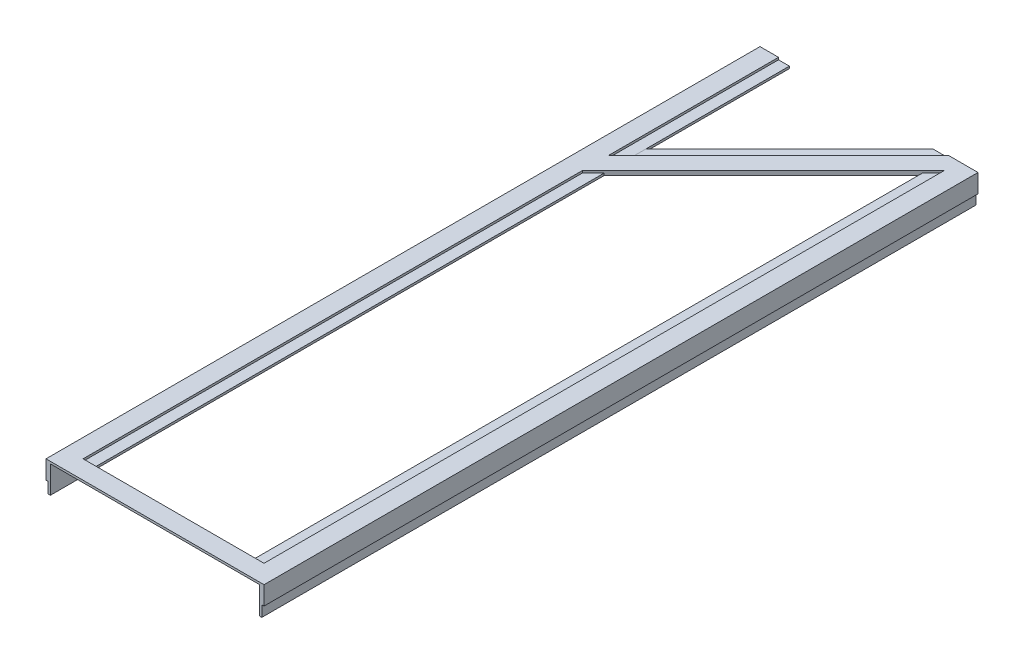
ISO-10303-21;
HEADER;
FILE_DESCRIPTION(('STEP AP214'),'2;1');
FILE_NAME('part.step','',(''),(''),'','','');
FILE_SCHEMA(('AUTOMOTIVE_DESIGN { 1 0 10303 214 1 1 1 1 }'));
ENDSEC;
DATA;
#1=APPLICATION_CONTEXT('core data for automotive mechanical design processes');
#2=APPLICATION_PROTOCOL_DEFINITION('international standard','automotive_design',2000,#1);
#3=PRODUCT_CONTEXT('',#1,'mechanical');
#4=PRODUCT('Part','Part','',(#3));
#5=PRODUCT_RELATED_PRODUCT_CATEGORY('part','',(#4));
#6=PRODUCT_DEFINITION_FORMATION('','',#4);
#7=PRODUCT_DEFINITION_CONTEXT('part definition',#1,'design');
#8=PRODUCT_DEFINITION('design','',#6,#7);
#9=PRODUCT_DEFINITION_SHAPE('','',#8);
#10=(LENGTH_UNIT() NAMED_UNIT(*) SI_UNIT(.MILLI.,.METRE.));
#11=(NAMED_UNIT(*) PLANE_ANGLE_UNIT() SI_UNIT($,.RADIAN.));
#12=(NAMED_UNIT(*) SI_UNIT($,.STERADIAN.) SOLID_ANGLE_UNIT());
#13=UNCERTAINTY_MEASURE_WITH_UNIT(LENGTH_MEASURE(1.E-05),#10,'distance_accuracy_value','');
#14=(GEOMETRIC_REPRESENTATION_CONTEXT(3) GLOBAL_UNCERTAINTY_ASSIGNED_CONTEXT((#13)) GLOBAL_UNIT_ASSIGNED_CONTEXT((#10,
#11,#12)) REPRESENTATION_CONTEXT('',''));
#15=CARTESIAN_POINT('',(0.,0.,0.));
#16=DIRECTION('',(0.,0.,1.));
#17=DIRECTION('',(1.,0.,0.));
#18=AXIS2_PLACEMENT_3D('',#15,#16,#17);
#19=CARTESIAN_POINT('',(2.,25.,327.5));
#20=DIRECTION('',(0.,1.,0.));
#21=DIRECTION('',(1.,0.,0.));
#22=AXIS2_PLACEMENT_3D('',#19,#20,#21);
#23=PLANE('',#22);
#24=DIRECTION('',(1.,0.,0.));
#25=VECTOR('',#24,1.);
#26=CARTESIAN_POINT('',(100.,25.,319.));
#27=LINE('',#26,#25);
#28=CARTESIAN_POINT('',(13.5,25.,319.));
#29=VERTEX_POINT('',#28);
#30=CARTESIAN_POINT('',(86.5,25.,319.));
#31=VERTEX_POINT('',#30);
#32=EDGE_CURVE('E459',#29,#31,#27,.T.);
#33=ORIENTED_EDGE('',*,*,#32,.T.);
#34=DIRECTION('',(0.,0.,-1.));
#35=VECTOR('',#34,1.);
#36=CARTESIAN_POINT('',(86.5,25.,327.5));
#37=LINE('',#36,#35);
#38=CARTESIAN_POINT('',(86.5,25.,12.0208152801714));
#39=VERTEX_POINT('',#38);
#40=EDGE_CURVE('E533',#31,#39,#37,.T.);
#41=ORIENTED_EDGE('',*,*,#40,.T.);
#42=DIRECTION('',(0.707106781186544,0.,-0.707106781186551));
#43=VECTOR('',#42,1.);
#44=CARTESIAN_POINT('',(13.5,25.,85.0208152801722));
#45=LINE('',#44,#43);
#46=CARTESIAN_POINT('',(13.5,25.,85.0208152801722));
#47=VERTEX_POINT('',#46);
#48=EDGE_CURVE('E554',#47,#39,#45,.T.);
#49=ORIENTED_EDGE('',*,*,#48,.F.);
#50=DIRECTION('',(0.,0.,-1.));
#51=VECTOR('',#50,1.);
#52=CARTESIAN_POINT('',(13.5,25.,327.5));
#53=LINE('',#52,#51);
#54=EDGE_CURVE('E331',#29,#47,#53,.T.);
#55=ORIENTED_EDGE('',*,*,#54,.F.);
#56=EDGE_LOOP('',(#33,#41,#49,#55));
#57=FACE_BOUND('',#56,.T.);
#58=DIRECTION('',(1.,0.,0.));
#59=VECTOR('',#58,1.);
#60=CARTESIAN_POINT('',(2.,25.,326.5));
#61=LINE('',#60,#59);
#62=CARTESIAN_POINT('',(2.,25.,326.5));
#63=VERTEX_POINT('',#62);
#64=CARTESIAN_POINT('',(21.5,25.,326.5));
#65=VERTEX_POINT('',#64);
#66=EDGE_CURVE('E418',#63,#65,#61,.T.);
#67=ORIENTED_EDGE('',*,*,#66,.F.);
#68=DIRECTION('',(0.,0.,-1.));
#69=VECTOR('',#68,1.);
#70=CARTESIAN_POINT('',(2.,25.,327.5));
#71=LINE('',#70,#69);
#72=CARTESIAN_POINT('',(2.,25.,0.));
#73=VERTEX_POINT('',#72);
#74=EDGE_CURVE('E327',#63,#73,#71,.T.);
#75=ORIENTED_EDGE('',*,*,#74,.T.);
#76=DIRECTION('',(-1.,0.,0.));
#77=VECTOR('',#76,1.);
#78=CARTESIAN_POINT('',(2.,25.,0.));
#79=LINE('',#78,#77);
#80=CARTESIAN_POINT('',(13.5,25.,0.));
#81=VERTEX_POINT('',#80);
#82=EDGE_CURVE('E387',#81,#73,#79,.T.);
#83=ORIENTED_EDGE('',*,*,#82,.F.);
#84=CARTESIAN_POINT('',(13.5,25.,73.0000000000008));
#85=VERTEX_POINT('',#84);
#86=EDGE_CURVE('E330',#85,#81,#53,.T.);
#87=ORIENTED_EDGE('',*,*,#86,.F.);
#88=DIRECTION('',(-0.707106781186544,0.,0.707106781186551));
#89=VECTOR('',#88,1.);
#90=CARTESIAN_POINT('',(86.5,25.,0.));
#91=LINE('',#90,#89);
#92=CARTESIAN_POINT('',(86.5,25.,0.));
#93=VERTEX_POINT('',#92);
#94=EDGE_CURVE('E551',#93,#85,#91,.T.);
#95=ORIENTED_EDGE('',*,*,#94,.F.);
#96=DIRECTION('',(-1.,0.,0.));
#97=VECTOR('',#96,1.);
#98=CARTESIAN_POINT('',(86.5,25.,0.));
#99=LINE('',#98,#97);
#100=CARTESIAN_POINT('',(98.,25.,0.));
#101=VERTEX_POINT('',#100);
#102=EDGE_CURVE('E520',#101,#93,#99,.T.);
#103=ORIENTED_EDGE('',*,*,#102,.F.);
#104=DIRECTION('',(0.,0.,-1.));
#105=VECTOR('',#104,1.);
#106=CARTESIAN_POINT('',(98.,25.,327.5));
#107=LINE('',#106,#105);
#108=CARTESIAN_POINT('',(98.,25.,326.5));
#109=VERTEX_POINT('',#108);
#110=EDGE_CURVE('E536',#109,#101,#107,.T.);
#111=ORIENTED_EDGE('',*,*,#110,.F.);
#112=CARTESIAN_POINT('',(78.5,25.,326.5));
#113=VERTEX_POINT('',#112);
#114=EDGE_CURVE('E413',#113,#109,#61,.T.);
#115=ORIENTED_EDGE('',*,*,#114,.F.);
#116=CARTESIAN_POINT('',(73.5,25.,326.5));
#117=DIRECTION('',(0.,1.,0.));
#118=DIRECTION('',(-1.,0.,0.));
#119=AXIS2_PLACEMENT_3D('',#116,#117,#118);
#120=CIRCLE('',#119,5.00000000000001);
#121=CARTESIAN_POINT('',(68.5,25.,326.5));
#122=VERTEX_POINT('',#121);
#123=EDGE_CURVE('E426',#113,#122,#120,.T.);
#124=ORIENTED_EDGE('',*,*,#123,.T.);
#125=CARTESIAN_POINT('',(31.5,25.,326.5));
#126=VERTEX_POINT('',#125);
#127=EDGE_CURVE('E416',#126,#122,#61,.T.);
#128=ORIENTED_EDGE('',*,*,#127,.F.);
#129=CARTESIAN_POINT('',(26.5,25.,326.5));
#130=DIRECTION('',(0.,1.,0.));
#131=DIRECTION('',(-1.,0.,0.));
#132=AXIS2_PLACEMENT_3D('',#129,#130,#131);
#133=CIRCLE('',#132,5.00000000000001);
#134=EDGE_CURVE('E438',#126,#65,#133,.T.);
#135=ORIENTED_EDGE('',*,*,#134,.T.);
#136=EDGE_LOOP('',(#67,#75,#83,#87,#95,#103,#111,#115,#124,#128,#135));
#137=FACE_BOUND('',#136,.T.);
#138=ADVANCED_FACE('F81',(#57,#137),#23,.F.);
#139=CARTESIAN_POINT('',(0.,27.,327.5));
#140=DIRECTION('',(0.,0.,-1.));
#141=DIRECTION('',(-1.,0.,0.));
#142=AXIS2_PLACEMENT_3D('',#139,#140,#141);
#143=PLANE('',#142);
#144=DIRECTION('',(1.,0.,0.));
#145=VECTOR('',#144,1.);
#146=CARTESIAN_POINT('',(0.,26.,327.5));
#147=LINE('',#146,#145);
#148=CARTESIAN_POINT('',(2.,26.,327.5));
#149=VERTEX_POINT('',#148);
#150=CARTESIAN_POINT('',(98.,26.,327.5));
#151=VERTEX_POINT('',#150);
#152=EDGE_CURVE('E13',#149,#151,#147,.T.);
#153=ORIENTED_EDGE('',*,*,#152,.T.);
#154=DIRECTION('',(0.,1.,0.));
#155=VECTOR('',#154,1.);
#156=CARTESIAN_POINT('',(98.,25.,327.5));
#157=LINE('',#156,#155);
#158=CARTESIAN_POINT('',(98.,13.5,327.5));
#159=VERTEX_POINT('',#158);
#160=EDGE_CURVE('E503',#159,#151,#157,.T.);
#161=ORIENTED_EDGE('',*,*,#160,.F.);
#162=DIRECTION('',(-1.,0.,0.));
#163=VECTOR('',#162,1.);
#164=CARTESIAN_POINT('',(98.,13.5,327.5));
#165=LINE('',#164,#163);
#166=CARTESIAN_POINT('',(99.,13.5,327.5));
#167=VERTEX_POINT('',#166);
#168=EDGE_CURVE('E500',#167,#159,#165,.T.);
#169=ORIENTED_EDGE('',*,*,#168,.F.);
#170=DIRECTION('',(0.,-1.,0.));
#171=VECTOR('',#170,1.);
#172=CARTESIAN_POINT('',(99.,13.5,327.5));
#173=LINE('',#172,#171);
#174=CARTESIAN_POINT('',(99.,18.5,327.5));
#175=VERTEX_POINT('',#174);
#176=EDGE_CURVE('E497',#175,#167,#173,.T.);
#177=ORIENTED_EDGE('',*,*,#176,.F.);
#178=DIRECTION('',(-1.,0.,0.));
#179=VECTOR('',#178,1.);
#180=CARTESIAN_POINT('',(99.,18.5,327.5));
#181=LINE('',#180,#179);
#182=CARTESIAN_POINT('',(100.,18.5,327.5));
#183=VERTEX_POINT('',#182);
#184=EDGE_CURVE('E493',#183,#175,#181,.T.);
#185=ORIENTED_EDGE('',*,*,#184,.F.);
#186=DIRECTION('',(0.,-1.,0.));
#187=VECTOR('',#186,1.);
#188=CARTESIAN_POINT('',(100.,18.5,327.5));
#189=LINE('',#188,#187);
#190=CARTESIAN_POINT('',(100.,27.,327.5));
#191=VERTEX_POINT('',#190);
#192=EDGE_CURVE('E490',#191,#183,#189,.T.);
#193=ORIENTED_EDGE('',*,*,#192,.F.);
#194=DIRECTION('',(1.,0.,0.));
#195=VECTOR('',#194,1.);
#196=CARTESIAN_POINT('',(8.5,27.,327.5));
#197=LINE('',#196,#195);
#198=CARTESIAN_POINT('',(0.,27.,327.5));
#199=VERTEX_POINT('',#198);
#200=EDGE_CURVE('E361',#199,#191,#197,.T.);
#201=ORIENTED_EDGE('',*,*,#200,.F.);
#202=DIRECTION('',(0.,1.,0.));
#203=VECTOR('',#202,1.);
#204=CARTESIAN_POINT('',(0.,27.,327.5));
#205=LINE('',#204,#203);
#206=CARTESIAN_POINT('',(0.,18.5,327.5));
#207=VERTEX_POINT('',#206);
#208=EDGE_CURVE('E374',#207,#199,#205,.T.);
#209=ORIENTED_EDGE('',*,*,#208,.F.);
#210=DIRECTION('',(-1.,0.,0.));
#211=VECTOR('',#210,1.);
#212=CARTESIAN_POINT('',(0.,18.5,327.5));
#213=LINE('',#212,#211);
#214=CARTESIAN_POINT('',(1.,18.5,327.5));
#215=VERTEX_POINT('',#214);
#216=EDGE_CURVE('E372',#215,#207,#213,.T.);
#217=ORIENTED_EDGE('',*,*,#216,.F.);
#218=DIRECTION('',(0.,1.,0.));
#219=VECTOR('',#218,1.);
#220=CARTESIAN_POINT('',(1.,18.5,327.5));
#221=LINE('',#220,#219);
#222=CARTESIAN_POINT('',(1.,13.5,327.5));
#223=VERTEX_POINT('',#222);
#224=EDGE_CURVE('E313',#223,#215,#221,.T.);
#225=ORIENTED_EDGE('',*,*,#224,.F.);
#226=DIRECTION('',(-1.,0.,0.));
#227=VECTOR('',#226,1.);
#228=CARTESIAN_POINT('',(1.,13.5,327.5));
#229=LINE('',#228,#227);
#230=CARTESIAN_POINT('',(2.,13.5,327.5));
#231=VERTEX_POINT('',#230);
#232=EDGE_CURVE('E368',#231,#223,#229,.T.);
#233=ORIENTED_EDGE('',*,*,#232,.F.);
#234=DIRECTION('',(0.,-1.,0.));
#235=VECTOR('',#234,1.);
#236=CARTESIAN_POINT('',(2.,13.5,327.5));
#237=LINE('',#236,#235);
#238=EDGE_CURVE('E364',#149,#231,#237,.T.);
#239=ORIENTED_EDGE('',*,*,#238,.F.);
#240=EDGE_LOOP('',(#153,#161,#169,#177,#185,#193,#201,#209,#217,#225,#233,#239));
#241=FACE_BOUND('',#240,.T.);
#242=ADVANCED_FACE('F605',(#241),#143,.F.);
#243=CARTESIAN_POINT('',(8.5,26.,327.5));
#244=DIRECTION('',(-1.,0.,0.));
#245=DIRECTION('',(0.,0.,1.));
#246=AXIS2_PLACEMENT_3D('',#243,#244,#245);
#247=PLANE('',#246);
#248=DIRECTION('',(0.,0.,-1.));
#249=VECTOR('',#248,1.);
#250=CARTESIAN_POINT('',(8.5,26.,327.5));
#251=LINE('',#250,#249);
#252=CARTESIAN_POINT('',(8.5,26.,319.));
#253=VERTEX_POINT('',#252);
#254=CARTESIAN_POINT('',(8.5,26.,90.0208152801721));
#255=VERTEX_POINT('',#254);
#256=EDGE_CURVE('E338',#253,#255,#251,.T.);
#257=ORIENTED_EDGE('',*,*,#256,.T.);
#258=DIRECTION('',(0.,-1.,0.));
#259=VECTOR('',#258,1.);
#260=CARTESIAN_POINT('',(8.5,27.,90.0208152801721));
#261=LINE('',#260,#259);
#262=CARTESIAN_POINT('',(8.5,27.,90.0208152801721));
#263=VERTEX_POINT('',#262);
#264=EDGE_CURVE('E486',#263,#255,#261,.T.);
#265=ORIENTED_EDGE('',*,*,#264,.F.);
#266=DIRECTION('',(0.,0.,-1.));
#267=VECTOR('',#266,1.);
#268=CARTESIAN_POINT('',(8.5,27.,327.5));
#269=LINE('',#268,#267);
#270=CARTESIAN_POINT('',(8.50000000000001,27.,319.));
#271=VERTEX_POINT('',#270);
#272=EDGE_CURVE('E342',#271,#263,#269,.T.);
#273=ORIENTED_EDGE('',*,*,#272,.F.);
#274=DIRECTION('',(0.,1.,0.));
#275=VECTOR('',#274,1.);
#276=CARTESIAN_POINT('',(8.5,26.,319.));
#277=LINE('',#276,#275);
#278=EDGE_CURVE('E470',#253,#271,#277,.T.);
#279=ORIENTED_EDGE('',*,*,#278,.F.);
#280=EDGE_LOOP('',(#257,#265,#273,#279));
#281=FACE_BOUND('',#280,.T.);
#282=ADVANCED_FACE('F584',(#281),#247,.F.);
#283=CARTESIAN_POINT('',(13.5,26.,327.5));
#284=DIRECTION('',(0.,-1.,0.));
#285=DIRECTION('',(-1.,0.,0.));
#286=AXIS2_PLACEMENT_3D('',#283,#284,#285);
#287=PLANE('',#286);
#288=DIRECTION('',(0.,0.,-1.));
#289=VECTOR('',#288,1.);
#290=CARTESIAN_POINT('',(13.5,26.,327.5));
#291=LINE('',#290,#289);
#292=CARTESIAN_POINT('',(13.5,26.,319.));
#293=VERTEX_POINT('',#292);
#294=CARTESIAN_POINT('',(13.5,26.,85.0208152801722));
#295=VERTEX_POINT('',#294);
#296=EDGE_CURVE('E334',#293,#295,#291,.T.);
#297=ORIENTED_EDGE('',*,*,#296,.T.);
#298=DIRECTION('',(-0.707106781186549,0.,0.707106781186546));
#299=VECTOR('',#298,1.);
#300=CARTESIAN_POINT('',(49.260407640086,26.,49.2604076400863));
#301=LINE('',#300,#299);
#302=EDGE_CURVE('E481',#295,#255,#301,.T.);
#303=ORIENTED_EDGE('',*,*,#302,.T.);
#304=ORIENTED_EDGE('',*,*,#256,.F.);
#305=DIRECTION('',(-1.,0.,0.));
#306=VECTOR('',#305,1.);
#307=CARTESIAN_POINT('',(13.5,26.,319.));
#308=LINE('',#307,#306);
#309=EDGE_CURVE('E468',#293,#253,#308,.T.);
#310=ORIENTED_EDGE('',*,*,#309,.F.);
#311=EDGE_LOOP('',(#297,#303,#304,#310));
#312=FACE_BOUND('',#311,.T.);
#313=ADVANCED_FACE('F587',(#312),#287,.F.);
#314=CARTESIAN_POINT('',(13.5,25.,327.5));
#315=DIRECTION('',(-1.,0.,0.));
#316=DIRECTION('',(0.,0.,1.));
#317=AXIS2_PLACEMENT_3D('',#314,#315,#316);
#318=PLANE('',#317);
#319=DIRECTION('',(0.,-1.,0.));
#320=VECTOR('',#319,1.);
#321=CARTESIAN_POINT('',(13.5,27.,73.0000000000008));
#322=LINE('',#321,#320);
#323=CARTESIAN_POINT('',(13.5,26.,73.0000000000008));
#324=VERTEX_POINT('',#323);
#325=EDGE_CURVE('E345',#324,#85,#322,.T.);
#326=ORIENTED_EDGE('',*,*,#325,.T.);
#327=ORIENTED_EDGE('',*,*,#86,.T.);
#328=DIRECTION('',(0.,-1.,0.));
#329=VECTOR('',#328,1.);
#330=CARTESIAN_POINT('',(13.5,25.,0.));
#331=LINE('',#330,#329);
#332=CARTESIAN_POINT('',(13.5,26.,0.));
#333=VERTEX_POINT('',#332);
#334=EDGE_CURVE('E385',#333,#81,#331,.T.);
#335=ORIENTED_EDGE('',*,*,#334,.F.);
#336=EDGE_CURVE('E333',#324,#333,#291,.T.);
#337=ORIENTED_EDGE('',*,*,#336,.F.);
#338=EDGE_LOOP('',(#326,#327,#335,#337));
#339=FACE_BOUND('',#338,.T.);
#340=ADVANCED_FACE('F592',(#339),#318,.F.);
#341=CARTESIAN_POINT('',(8.5,27.,327.5));
#342=DIRECTION('',(0.,-1.,0.));
#343=DIRECTION('',(-1.,0.,0.));
#344=AXIS2_PLACEMENT_3D('',#341,#342,#343);
#345=PLANE('',#344);
#346=ORIENTED_EDGE('',*,*,#272,.T.);
#347=DIRECTION('',(0.707106781186544,0.,-0.707106781186551));
#348=VECTOR('',#347,1.);
#349=CARTESIAN_POINT('',(13.5,27.,85.0208152801722));
#350=LINE('',#349,#348);
#351=CARTESIAN_POINT('',(91.5,27.,7.02081528017151));
#352=VERTEX_POINT('',#351);
#353=EDGE_CURVE('E360',#263,#352,#350,.T.);
#354=ORIENTED_EDGE('',*,*,#353,.T.);
#355=DIRECTION('',(0.,0.,-1.));
#356=VECTOR('',#355,1.);
#357=CARTESIAN_POINT('',(91.5,27.,327.5));
#358=LINE('',#357,#356);
#359=CARTESIAN_POINT('',(91.5,27.,319.));
#360=VERTEX_POINT('',#359);
#361=EDGE_CURVE('E527',#360,#352,#358,.T.);
#362=ORIENTED_EDGE('',*,*,#361,.F.);
#363=DIRECTION('',(1.,0.,0.));
#364=VECTOR('',#363,1.);
#365=CARTESIAN_POINT('',(100.,27.,319.));
#366=LINE('',#365,#364);
#367=EDGE_CURVE('E432',#271,#360,#366,.T.);
#368=ORIENTED_EDGE('',*,*,#367,.F.);
#369=EDGE_LOOP('',(#346,#354,#362,#368));
#370=FACE_BOUND('',#369,.T.);
#371=DIRECTION('',(1.,0.,0.));
#372=VECTOR('',#371,1.);
#373=CARTESIAN_POINT('',(100.,27.,0.));
#374=LINE('',#373,#372);
#375=CARTESIAN_POINT('',(86.5,27.,0.));
#376=VERTEX_POINT('',#375);
#377=CARTESIAN_POINT('',(100.,27.,0.));
#378=VERTEX_POINT('',#377);
#379=EDGE_CURVE('E494',#376,#378,#374,.T.);
#380=ORIENTED_EDGE('',*,*,#379,.F.);
#381=DIRECTION('',(-0.707106781186544,0.,0.707106781186551));
#382=VECTOR('',#381,1.);
#383=CARTESIAN_POINT('',(86.5,27.,0.));
#384=LINE('',#383,#382);
#385=CARTESIAN_POINT('',(8.5,27.,78.0000000000007));
#386=VERTEX_POINT('',#385);
#387=EDGE_CURVE('E552',#376,#386,#384,.T.);
#388=ORIENTED_EDGE('',*,*,#387,.T.);
#389=CARTESIAN_POINT('',(8.5,27.,0.));
#390=VERTEX_POINT('',#389);
#391=EDGE_CURVE('E341',#386,#390,#269,.T.);
#392=ORIENTED_EDGE('',*,*,#391,.T.);
#393=DIRECTION('',(1.,0.,0.));
#394=VECTOR('',#393,1.);
#395=CARTESIAN_POINT('',(8.5,27.,0.));
#396=LINE('',#395,#394);
#397=CARTESIAN_POINT('',(0.,27.,0.));
#398=VERTEX_POINT('',#397);
#399=EDGE_CURVE('E377',#398,#390,#396,.T.);
#400=ORIENTED_EDGE('',*,*,#399,.F.);
#401=DIRECTION('',(0.,0.,-1.));
#402=VECTOR('',#401,1.);
#403=CARTESIAN_POINT('',(0.,27.,327.5));
#404=LINE('',#403,#402);
#405=EDGE_CURVE('E321',#199,#398,#404,.T.);
#406=ORIENTED_EDGE('',*,*,#405,.F.);
#407=ORIENTED_EDGE('',*,*,#200,.T.);
#408=DIRECTION('',(0.,0.,-1.));
#409=VECTOR('',#408,1.);
#410=CARTESIAN_POINT('',(100.,27.,327.5));
#411=LINE('',#410,#409);
#412=EDGE_CURVE('E506',#191,#378,#411,.T.);
#413=ORIENTED_EDGE('',*,*,#412,.T.);
#414=EDGE_LOOP('',(#380,#388,#392,#400,#406,#407,#413));
#415=FACE_BOUND('',#414,.T.);
#416=ADVANCED_FACE('F83',(#370,#415),#345,.F.);
#417=CARTESIAN_POINT('',(8.5,26.,78.0000000000007));
#418=VERTEX_POINT('',#417);
#419=CARTESIAN_POINT('',(8.5,26.,0.));
#420=VERTEX_POINT('',#419);
#421=EDGE_CURVE('E337',#418,#420,#251,.T.);
#422=ORIENTED_EDGE('',*,*,#421,.T.);
#423=DIRECTION('',(0.,-1.,0.));
#424=VECTOR('',#423,1.);
#425=CARTESIAN_POINT('',(8.5,26.,0.));
#426=LINE('',#425,#424);
#427=EDGE_CURVE('E380',#390,#420,#426,.T.);
#428=ORIENTED_EDGE('',*,*,#427,.F.);
#429=ORIENTED_EDGE('',*,*,#391,.F.);
#430=DIRECTION('',(0.,-1.,0.));
#431=VECTOR('',#430,1.);
#432=CARTESIAN_POINT('',(8.5,27.,78.0000000000007));
#433=LINE('',#432,#431);
#434=EDGE_CURVE('E483',#386,#418,#433,.T.);
#435=ORIENTED_EDGE('',*,*,#434,.T.);
#436=EDGE_LOOP('',(#422,#428,#429,#435));
#437=FACE_BOUND('',#436,.T.);
#438=ADVANCED_FACE('F599',(#437),#247,.F.);
#439=ORIENTED_EDGE('',*,*,#336,.T.);
#440=DIRECTION('',(1.,0.,0.));
#441=VECTOR('',#440,1.);
#442=CARTESIAN_POINT('',(13.5,26.,0.));
#443=LINE('',#442,#441);
#444=EDGE_CURVE('E383',#420,#333,#443,.T.);
#445=ORIENTED_EDGE('',*,*,#444,.F.);
#446=ORIENTED_EDGE('',*,*,#421,.F.);
#447=DIRECTION('',(-0.707106781186551,0.,0.707106781186544));
#448=VECTOR('',#447,1.);
#449=CARTESIAN_POINT('',(43.2500000000003,26.,43.2500000000008));
#450=LINE('',#449,#448);
#451=EDGE_CURVE('E479',#324,#418,#450,.T.);
#452=ORIENTED_EDGE('',*,*,#451,.F.);
#453=EDGE_LOOP('',(#439,#445,#446,#452));
#454=FACE_BOUND('',#453,.T.);
#455=ADVANCED_FACE('F590',(#454),#287,.F.);
#456=ORIENTED_EDGE('',*,*,#54,.T.);
#457=DIRECTION('',(0.,-1.,0.));
#458=VECTOR('',#457,1.);
#459=CARTESIAN_POINT('',(13.5,27.,85.0208152801722));
#460=LINE('',#459,#458);
#461=EDGE_CURVE('E344',#295,#47,#460,.T.);
#462=ORIENTED_EDGE('',*,*,#461,.F.);
#463=ORIENTED_EDGE('',*,*,#296,.F.);
#464=DIRECTION('',(0.,1.,0.));
#465=VECTOR('',#464,1.);
#466=CARTESIAN_POINT('',(13.5,25.,319.));
#467=LINE('',#466,#465);
#468=EDGE_CURVE('E96',#29,#293,#467,.T.);
#469=ORIENTED_EDGE('',*,*,#468,.F.);
#470=EDGE_LOOP('',(#456,#462,#463,#469));
#471=FACE_BOUND('',#470,.T.);
#472=ADVANCED_FACE('F588',(#471),#318,.F.);
#473=CARTESIAN_POINT('',(2.,13.5,327.5));
#474=DIRECTION('',(-1.,0.,0.));
#475=DIRECTION('',(0.,1.,0.));
#476=AXIS2_PLACEMENT_3D('',#473,#474,#475);
#477=PLANE('',#476);
#478=DIRECTION('',(0.,-1.,0.));
#479=VECTOR('',#478,1.);
#480=CARTESIAN_POINT('',(2.,18.5,84.5));
#481=LINE('',#480,#479);
#482=CARTESIAN_POINT('',(2.,18.5,84.5));
#483=VERTEX_POINT('',#482);
#484=CARTESIAN_POINT('',(2.,13.5,84.5));
#485=VERTEX_POINT('',#484);
#486=EDGE_CURVE('E301',#483,#485,#481,.T.);
#487=ORIENTED_EDGE('',*,*,#486,.F.);
#488=DIRECTION('',(0.,0.,-1.));
#489=VECTOR('',#488,1.);
#490=CARTESIAN_POINT('',(2.,18.5,84.5));
#491=LINE('',#490,#489);
#492=CARTESIAN_POINT('',(2.,18.5,0.));
#493=VERTEX_POINT('',#492);
#494=EDGE_CURVE('E298',#483,#493,#491,.T.);
#495=ORIENTED_EDGE('',*,*,#494,.T.);
#496=DIRECTION('',(0.,-1.,0.));
#497=VECTOR('',#496,1.);
#498=CARTESIAN_POINT('',(2.,13.5,0.));
#499=LINE('',#498,#497);
#500=EDGE_CURVE('E390',#73,#493,#499,.T.);
#501=ORIENTED_EDGE('',*,*,#500,.F.);
#502=ORIENTED_EDGE('',*,*,#74,.F.);
#503=DIRECTION('',(0.,-1.,0.));
#504=VECTOR('',#503,1.);
#505=CARTESIAN_POINT('',(2.,26.,326.5));
#506=LINE('',#505,#504);
#507=CARTESIAN_POINT('',(2.,26.,326.5));
#508=VERTEX_POINT('',#507);
#509=EDGE_CURVE('E441',#508,#63,#506,.T.);
#510=ORIENTED_EDGE('',*,*,#509,.F.);
#511=DIRECTION('',(0.,0.,-1.));
#512=VECTOR('',#511,1.);
#513=CARTESIAN_POINT('',(2.,26.,327.5));
#514=LINE('',#513,#512);
#515=EDGE_CURVE('E442',#149,#508,#514,.T.);
#516=ORIENTED_EDGE('',*,*,#515,.F.);
#517=ORIENTED_EDGE('',*,*,#238,.T.);
#518=DIRECTION('',(0.,0.,-1.));
#519=VECTOR('',#518,1.);
#520=CARTESIAN_POINT('',(2.,13.5,327.5));
#521=LINE('',#520,#519);
#522=EDGE_CURVE('E318',#231,#485,#521,.T.);
#523=ORIENTED_EDGE('',*,*,#522,.T.);
#524=EDGE_LOOP('',(#487,#495,#501,#502,#510,#516,#517,#523));
#525=FACE_BOUND('',#524,.T.);
#526=ADVANCED_FACE('F411',(#525),#477,.F.);
#527=CARTESIAN_POINT('',(1.,13.5,327.5));
#528=DIRECTION('',(0.,1.,0.));
#529=DIRECTION('',(0.,0.,-1.));
#530=AXIS2_PLACEMENT_3D('',#527,#528,#529);
#531=PLANE('',#530);
#532=DIRECTION('',(0.,0.,-1.));
#533=VECTOR('',#532,1.);
#534=CARTESIAN_POINT('',(1.,13.5,327.5));
#535=LINE('',#534,#533);
#536=CARTESIAN_POINT('',(1.,13.5,84.5));
#537=VERTEX_POINT('',#536);
#538=EDGE_CURVE('E315',#223,#537,#535,.T.);
#539=ORIENTED_EDGE('',*,*,#538,.T.);
#540=DIRECTION('',(-1.,0.,0.));
#541=VECTOR('',#540,1.);
#542=CARTESIAN_POINT('',(1.,13.5,84.5));
#543=LINE('',#542,#541);
#544=EDGE_CURVE('E307',#485,#537,#543,.T.);
#545=ORIENTED_EDGE('',*,*,#544,.F.);
#546=ORIENTED_EDGE('',*,*,#522,.F.);
#547=ORIENTED_EDGE('',*,*,#232,.T.);
#548=EDGE_LOOP('',(#539,#545,#546,#547));
#549=FACE_BOUND('',#548,.T.);
#550=ADVANCED_FACE('F597',(#549),#531,.F.);
#551=CARTESIAN_POINT('',(1.,18.5,327.5));
#552=DIRECTION('',(1.,0.,0.));
#553=DIRECTION('',(0.,0.,-1.));
#554=AXIS2_PLACEMENT_3D('',#551,#552,#553);
#555=PLANE('',#554);
#556=DIRECTION('',(0.,0.,-1.));
#557=VECTOR('',#556,1.);
#558=CARTESIAN_POINT('',(1.,18.5,327.5));
#559=LINE('',#558,#557);
#560=CARTESIAN_POINT('',(1.,18.5,84.5));
#561=VERTEX_POINT('',#560);
#562=EDGE_CURVE('E295',#215,#561,#559,.T.);
#563=ORIENTED_EDGE('',*,*,#562,.T.);
#564=DIRECTION('',(0.,1.,0.));
#565=VECTOR('',#564,1.);
#566=CARTESIAN_POINT('',(1.,18.5,84.5));
#567=LINE('',#566,#565);
#568=EDGE_CURVE('E302',#537,#561,#567,.T.);
#569=ORIENTED_EDGE('',*,*,#568,.F.);
#570=ORIENTED_EDGE('',*,*,#538,.F.);
#571=ORIENTED_EDGE('',*,*,#224,.T.);
#572=EDGE_LOOP('',(#563,#569,#570,#571));
#573=FACE_BOUND('',#572,.T.);
#574=ADVANCED_FACE('F311',(#573),#555,.F.);
#575=CARTESIAN_POINT('',(0.,18.5,327.5));
#576=DIRECTION('',(0.,1.,0.));
#577=DIRECTION('',(0.,0.,-1.));
#578=AXIS2_PLACEMENT_3D('',#575,#576,#577);
#579=PLANE('',#578);
#580=DIRECTION('',(-1.,0.,0.));
#581=VECTOR('',#580,1.);
#582=CARTESIAN_POINT('',(0.,18.5,0.));
#583=LINE('',#582,#581);
#584=CARTESIAN_POINT('',(0.,18.5,0.));
#585=VERTEX_POINT('',#584);
#586=EDGE_CURVE('E393',#493,#585,#583,.T.);
#587=ORIENTED_EDGE('',*,*,#586,.F.);
#588=ORIENTED_EDGE('',*,*,#494,.F.);
#589=DIRECTION('',(1.,0.,0.));
#590=VECTOR('',#589,1.);
#591=CARTESIAN_POINT('',(1.,18.5,84.5));
#592=LINE('',#591,#590);
#593=EDGE_CURVE('E290',#561,#483,#592,.T.);
#594=ORIENTED_EDGE('',*,*,#593,.F.);
#595=ORIENTED_EDGE('',*,*,#562,.F.);
#596=ORIENTED_EDGE('',*,*,#216,.T.);
#597=DIRECTION('',(0.,0.,-1.));
#598=VECTOR('',#597,1.);
#599=CARTESIAN_POINT('',(0.,18.5,327.5));
#600=LINE('',#599,#598);
#601=EDGE_CURVE('E316',#207,#585,#600,.T.);
#602=ORIENTED_EDGE('',*,*,#601,.T.);
#603=EDGE_LOOP('',(#587,#588,#594,#595,#596,#602));
#604=FACE_BOUND('',#603,.T.);
#605=ADVANCED_FACE('F292',(#604),#579,.F.);
#606=CARTESIAN_POINT('',(0.,27.,327.5));
#607=DIRECTION('',(1.,0.,0.));
#608=DIRECTION('',(0.,0.,-1.));
#609=AXIS2_PLACEMENT_3D('',#606,#607,#608);
#610=PLANE('',#609);
#611=DIRECTION('',(0.,1.,0.));
#612=VECTOR('',#611,1.);
#613=CARTESIAN_POINT('',(0.,27.,0.));
#614=LINE('',#613,#612);
#615=EDGE_CURVE('E365',#585,#398,#614,.T.);
#616=ORIENTED_EDGE('',*,*,#615,.F.);
#617=ORIENTED_EDGE('',*,*,#601,.F.);
#618=ORIENTED_EDGE('',*,*,#208,.T.);
#619=ORIENTED_EDGE('',*,*,#405,.T.);
#620=EDGE_LOOP('',(#616,#617,#618,#619));
#621=FACE_BOUND('',#620,.T.);
#622=ADVANCED_FACE('F399',(#621),#610,.F.);
#623=CARTESIAN_POINT('',(0.,27.,0.));
#624=DIRECTION('',(0.,0.,-1.));
#625=DIRECTION('',(-1.,0.,0.));
#626=AXIS2_PLACEMENT_3D('',#623,#624,#625);
#627=PLANE('',#626);
#628=ORIENTED_EDGE('',*,*,#500,.T.);
#629=ORIENTED_EDGE('',*,*,#586,.T.);
#630=ORIENTED_EDGE('',*,*,#615,.T.);
#631=ORIENTED_EDGE('',*,*,#399,.T.);
#632=ORIENTED_EDGE('',*,*,#427,.T.);
#633=ORIENTED_EDGE('',*,*,#444,.T.);
#634=ORIENTED_EDGE('',*,*,#334,.T.);
#635=ORIENTED_EDGE('',*,*,#82,.T.);
#636=EDGE_LOOP('',(#628,#629,#630,#631,#632,#633,#634,#635));
#637=FACE_BOUND('',#636,.T.);
#638=ADVANCED_FACE('F408',(#637),#627,.T.);
#639=CARTESIAN_POINT('',(13.5,27.,85.0208152801722));
#640=DIRECTION('',(0.707106781186551,0.,0.707106781186544));
#641=DIRECTION('',(0.707106781186544,0.,-0.707106781186551));
#642=AXIS2_PLACEMENT_3D('',#639,#640,#641);
#643=PLANE('',#642);
#644=ORIENTED_EDGE('',*,*,#48,.T.);
#645=DIRECTION('',(0.,-1.,0.));
#646=VECTOR('',#645,1.);
#647=CARTESIAN_POINT('',(86.5,27.,12.0208152801714));
#648=LINE('',#647,#646);
#649=CARTESIAN_POINT('',(86.5,26.,12.0208152801714));
#650=VERTEX_POINT('',#649);
#651=EDGE_CURVE('E359',#650,#39,#648,.T.);
#652=ORIENTED_EDGE('',*,*,#651,.F.);
#653=DIRECTION('',(0.707106781186555,0.,-0.70710678118654));
#654=VECTOR('',#653,1.);
#655=CARTESIAN_POINT('',(49.2604076400848,26.,49.2604076400858));
#656=LINE('',#655,#654);
#657=CARTESIAN_POINT('',(91.5,26.,7.02081528017151));
#658=VERTEX_POINT('',#657);
#659=EDGE_CURVE('E476',#650,#658,#656,.T.);
#660=ORIENTED_EDGE('',*,*,#659,.T.);
#661=DIRECTION('',(0.,-1.,0.));
#662=VECTOR('',#661,1.);
#663=CARTESIAN_POINT('',(91.5,27.,7.02081528017151));
#664=LINE('',#663,#662);
#665=EDGE_CURVE('E473',#352,#658,#664,.T.);
#666=ORIENTED_EDGE('',*,*,#665,.F.);
#667=ORIENTED_EDGE('',*,*,#353,.F.);
#668=ORIENTED_EDGE('',*,*,#264,.T.);
#669=ORIENTED_EDGE('',*,*,#302,.F.);
#670=ORIENTED_EDGE('',*,*,#461,.T.);
#671=EDGE_LOOP('',(#644,#652,#660,#666,#667,#668,#669,#670));
#672=FACE_BOUND('',#671,.T.);
#673=ADVANCED_FACE('F568',(#672),#643,.T.);
#674=CARTESIAN_POINT('',(86.5,27.,0.));
#675=DIRECTION('',(-0.707106781186551,0.,-0.707106781186544));
#676=DIRECTION('',(-0.707106781186544,0.,0.707106781186551));
#677=AXIS2_PLACEMENT_3D('',#674,#675,#676);
#678=PLANE('',#677);
#679=ORIENTED_EDGE('',*,*,#94,.T.);
#680=ORIENTED_EDGE('',*,*,#325,.F.);
#681=ORIENTED_EDGE('',*,*,#451,.T.);
#682=ORIENTED_EDGE('',*,*,#434,.F.);
#683=ORIENTED_EDGE('',*,*,#387,.F.);
#684=DIRECTION('',(0.,-1.,0.));
#685=VECTOR('',#684,1.);
#686=CARTESIAN_POINT('',(86.5,27.,0.));
#687=LINE('',#686,#685);
#688=EDGE_CURVE('E357',#376,#93,#687,.T.);
#689=ORIENTED_EDGE('',*,*,#688,.T.);
#690=EDGE_LOOP('',(#679,#680,#681,#682,#683,#689));
#691=FACE_BOUND('',#690,.T.);
#692=ADVANCED_FACE('F623',(#691),#678,.T.);
#693=CARTESIAN_POINT('',(100.,18.5,327.5));
#694=DIRECTION('',(-1.,0.,0.));
#695=DIRECTION('',(0.,0.,1.));
#696=AXIS2_PLACEMENT_3D('',#693,#694,#695);
#697=PLANE('',#696);
#698=ORIENTED_EDGE('',*,*,#412,.F.);
#699=ORIENTED_EDGE('',*,*,#192,.T.);
#700=DIRECTION('',(0.,0.,-1.));
#701=VECTOR('',#700,1.);
#702=CARTESIAN_POINT('',(100.,18.5,327.5));
#703=LINE('',#702,#701);
#704=CARTESIAN_POINT('',(100.,18.5,0.));
#705=VERTEX_POINT('',#704);
#706=EDGE_CURVE('E548',#183,#705,#703,.T.);
#707=ORIENTED_EDGE('',*,*,#706,.T.);
#708=DIRECTION('',(0.,-1.,0.));
#709=VECTOR('',#708,1.);
#710=CARTESIAN_POINT('',(100.,18.5,0.));
#711=LINE('',#710,#709);
#712=EDGE_CURVE('E489',#378,#705,#711,.T.);
#713=ORIENTED_EDGE('',*,*,#712,.F.);
#714=EDGE_LOOP('',(#698,#699,#707,#713));
#715=FACE_BOUND('',#714,.T.);
#716=ADVANCED_FACE('F626',(#715),#697,.F.);
#717=CARTESIAN_POINT('',(99.,18.5,327.5));
#718=DIRECTION('',(0.,1.,0.));
#719=DIRECTION('',(0.,0.,-1.));
#720=AXIS2_PLACEMENT_3D('',#717,#718,#719);
#721=PLANE('',#720);
#722=DIRECTION('',(-1.,0.,0.));
#723=VECTOR('',#722,1.);
#724=CARTESIAN_POINT('',(99.,18.5,0.));
#725=LINE('',#724,#723);
#726=CARTESIAN_POINT('',(99.,18.5,0.));
#727=VERTEX_POINT('',#726);
#728=EDGE_CURVE('E509',#705,#727,#725,.T.);
#729=ORIENTED_EDGE('',*,*,#728,.F.);
#730=ORIENTED_EDGE('',*,*,#706,.F.);
#731=ORIENTED_EDGE('',*,*,#184,.T.);
#732=DIRECTION('',(0.,0.,-1.));
#733=VECTOR('',#732,1.);
#734=CARTESIAN_POINT('',(99.,18.5,327.5));
#735=LINE('',#734,#733);
#736=EDGE_CURVE('E545',#175,#727,#735,.T.);
#737=ORIENTED_EDGE('',*,*,#736,.T.);
#738=EDGE_LOOP('',(#729,#730,#731,#737));
#739=FACE_BOUND('',#738,.T.);
#740=ADVANCED_FACE('F632',(#739),#721,.F.);
#741=CARTESIAN_POINT('',(99.,13.5,327.5));
#742=DIRECTION('',(-1.,0.,0.));
#743=DIRECTION('',(0.,0.,1.));
#744=AXIS2_PLACEMENT_3D('',#741,#742,#743);
#745=PLANE('',#744);
#746=DIRECTION('',(0.,-1.,0.));
#747=VECTOR('',#746,1.);
#748=CARTESIAN_POINT('',(99.,13.5,0.));
#749=LINE('',#748,#747);
#750=CARTESIAN_POINT('',(99.,13.5,0.));
#751=VERTEX_POINT('',#750);
#752=EDGE_CURVE('E512',#727,#751,#749,.T.);
#753=ORIENTED_EDGE('',*,*,#752,.F.);
#754=ORIENTED_EDGE('',*,*,#736,.F.);
#755=ORIENTED_EDGE('',*,*,#176,.T.);
#756=DIRECTION('',(0.,0.,-1.));
#757=VECTOR('',#756,1.);
#758=CARTESIAN_POINT('',(99.,13.5,327.5));
#759=LINE('',#758,#757);
#760=EDGE_CURVE('E542',#167,#751,#759,.T.);
#761=ORIENTED_EDGE('',*,*,#760,.T.);
#762=EDGE_LOOP('',(#753,#754,#755,#761));
#763=FACE_BOUND('',#762,.T.);
#764=ADVANCED_FACE('F636',(#763),#745,.F.);
#765=CARTESIAN_POINT('',(98.,13.5,327.5));
#766=DIRECTION('',(0.,1.,0.));
#767=DIRECTION('',(0.,0.,-1.));
#768=AXIS2_PLACEMENT_3D('',#765,#766,#767);
#769=PLANE('',#768);
#770=DIRECTION('',(-1.,0.,0.));
#771=VECTOR('',#770,1.);
#772=CARTESIAN_POINT('',(98.,13.5,0.));
#773=LINE('',#772,#771);
#774=CARTESIAN_POINT('',(98.,13.5,0.));
#775=VERTEX_POINT('',#774);
#776=EDGE_CURVE('E515',#751,#775,#773,.T.);
#777=ORIENTED_EDGE('',*,*,#776,.F.);
#778=ORIENTED_EDGE('',*,*,#760,.F.);
#779=ORIENTED_EDGE('',*,*,#168,.T.);
#780=DIRECTION('',(0.,0.,-1.));
#781=VECTOR('',#780,1.);
#782=CARTESIAN_POINT('',(98.,13.5,327.5));
#783=LINE('',#782,#781);
#784=EDGE_CURVE('E539',#159,#775,#783,.T.);
#785=ORIENTED_EDGE('',*,*,#784,.T.);
#786=EDGE_LOOP('',(#777,#778,#779,#785));
#787=FACE_BOUND('',#786,.T.);
#788=ADVANCED_FACE('F640',(#787),#769,.F.);
#789=CARTESIAN_POINT('',(98.,25.,327.5));
#790=DIRECTION('',(1.,0.,0.));
#791=DIRECTION('',(0.,0.,-1.));
#792=AXIS2_PLACEMENT_3D('',#789,#790,#791);
#793=PLANE('',#792);
#794=DIRECTION('',(0.,1.,0.));
#795=VECTOR('',#794,1.);
#796=CARTESIAN_POINT('',(98.,25.,0.));
#797=LINE('',#796,#795);
#798=EDGE_CURVE('E518',#775,#101,#797,.T.);
#799=ORIENTED_EDGE('',*,*,#798,.F.);
#800=ORIENTED_EDGE('',*,*,#784,.F.);
#801=ORIENTED_EDGE('',*,*,#160,.T.);
#802=DIRECTION('',(0.,0.,-1.));
#803=VECTOR('',#802,1.);
#804=CARTESIAN_POINT('',(98.,26.,327.5));
#805=LINE('',#804,#803);
#806=CARTESIAN_POINT('',(98.,26.,326.5));
#807=VERTEX_POINT('',#806);
#808=EDGE_CURVE('E449',#151,#807,#805,.T.);
#809=ORIENTED_EDGE('',*,*,#808,.T.);
#810=DIRECTION('',(0.,-1.,0.));
#811=VECTOR('',#810,1.);
#812=CARTESIAN_POINT('',(98.,26.,326.5));
#813=LINE('',#812,#811);
#814=EDGE_CURVE('E452',#807,#109,#813,.T.);
#815=ORIENTED_EDGE('',*,*,#814,.T.);
#816=ORIENTED_EDGE('',*,*,#110,.T.);
#817=EDGE_LOOP('',(#799,#800,#801,#809,#815,#816));
#818=FACE_BOUND('',#817,.T.);
#819=ADVANCED_FACE('F644',(#818),#793,.F.);
#820=CARTESIAN_POINT('',(86.5,26.,327.5));
#821=DIRECTION('',(1.,0.,0.));
#822=DIRECTION('',(0.,0.,-1.));
#823=AXIS2_PLACEMENT_3D('',#820,#821,#822);
#824=PLANE('',#823);
#825=DIRECTION('',(0.,0.,-1.));
#826=VECTOR('',#825,1.);
#827=CARTESIAN_POINT('',(86.5,26.,327.5));
#828=LINE('',#827,#826);
#829=CARTESIAN_POINT('',(86.5,26.,319.));
#830=VERTEX_POINT('',#829);
#831=EDGE_CURVE('E531',#830,#650,#828,.T.);
#832=ORIENTED_EDGE('',*,*,#831,.T.);
#833=ORIENTED_EDGE('',*,*,#651,.T.);
#834=ORIENTED_EDGE('',*,*,#40,.F.);
#835=DIRECTION('',(0.,-1.,0.));
#836=VECTOR('',#835,1.);
#837=CARTESIAN_POINT('',(86.5,26.,319.));
#838=LINE('',#837,#836);
#839=EDGE_CURVE('E465',#830,#31,#838,.T.);
#840=ORIENTED_EDGE('',*,*,#839,.F.);
#841=EDGE_LOOP('',(#832,#833,#834,#840));
#842=FACE_BOUND('',#841,.T.);
#843=ADVANCED_FACE('F562',(#842),#824,.F.);
#844=CARTESIAN_POINT('',(91.5,26.,327.5));
#845=DIRECTION('',(0.,-1.,0.));
#846=DIRECTION('',(-1.,0.,0.));
#847=AXIS2_PLACEMENT_3D('',#844,#845,#846);
#848=PLANE('',#847);
#849=DIRECTION('',(0.,0.,-1.));
#850=VECTOR('',#849,1.);
#851=CARTESIAN_POINT('',(91.5,26.,327.5));
#852=LINE('',#851,#850);
#853=CARTESIAN_POINT('',(91.5,26.,319.));
#854=VERTEX_POINT('',#853);
#855=EDGE_CURVE('E529',#854,#658,#852,.T.);
#856=ORIENTED_EDGE('',*,*,#855,.T.);
#857=ORIENTED_EDGE('',*,*,#659,.F.);
#858=ORIENTED_EDGE('',*,*,#831,.F.);
#859=DIRECTION('',(-1.,0.,0.));
#860=VECTOR('',#859,1.);
#861=CARTESIAN_POINT('',(91.5,26.,319.));
#862=LINE('',#861,#860);
#863=EDGE_CURVE('E462',#854,#830,#862,.T.);
#864=ORIENTED_EDGE('',*,*,#863,.F.);
#865=EDGE_LOOP('',(#856,#857,#858,#864));
#866=FACE_BOUND('',#865,.T.);
#867=ADVANCED_FACE('F576',(#866),#848,.F.);
#868=CARTESIAN_POINT('',(91.5,27.,327.5));
#869=DIRECTION('',(1.,0.,0.));
#870=DIRECTION('',(0.,0.,-1.));
#871=AXIS2_PLACEMENT_3D('',#868,#869,#870);
#872=PLANE('',#871);
#873=ORIENTED_EDGE('',*,*,#361,.T.);
#874=ORIENTED_EDGE('',*,*,#665,.T.);
#875=ORIENTED_EDGE('',*,*,#855,.F.);
#876=DIRECTION('',(0.,-1.,0.));
#877=VECTOR('',#876,1.);
#878=CARTESIAN_POINT('',(91.5,27.,319.));
#879=LINE('',#878,#877);
#880=EDGE_CURVE('E89',#360,#854,#879,.T.);
#881=ORIENTED_EDGE('',*,*,#880,.F.);
#882=EDGE_LOOP('',(#873,#874,#875,#881));
#883=FACE_BOUND('',#882,.T.);
#884=ADVANCED_FACE('F578',(#883),#872,.F.);
#885=CARTESIAN_POINT('',(0.,27.,0.));
#886=DIRECTION('',(0.,0.,-1.));
#887=DIRECTION('',(-1.,0.,0.));
#888=AXIS2_PLACEMENT_3D('',#885,#886,#887);
#889=PLANE('',#888);
#890=ORIENTED_EDGE('',*,*,#712,.T.);
#891=ORIENTED_EDGE('',*,*,#728,.T.);
#892=ORIENTED_EDGE('',*,*,#752,.T.);
#893=ORIENTED_EDGE('',*,*,#776,.T.);
#894=ORIENTED_EDGE('',*,*,#798,.T.);
#895=ORIENTED_EDGE('',*,*,#102,.T.);
#896=ORIENTED_EDGE('',*,*,#688,.F.);
#897=ORIENTED_EDGE('',*,*,#379,.T.);
#898=EDGE_LOOP('',(#890,#891,#892,#893,#894,#895,#896,#897));
#899=FACE_BOUND('',#898,.T.);
#900=ADVANCED_FACE('F655',(#899),#889,.T.);
#901=CARTESIAN_POINT('',(100.,25.,319.));
#902=DIRECTION('',(0.,0.,-1.));
#903=DIRECTION('',(-1.,0.,0.));
#904=AXIS2_PLACEMENT_3D('',#901,#902,#903);
#905=PLANE('',#904);
#906=ORIENTED_EDGE('',*,*,#278,.T.);
#907=ORIENTED_EDGE('',*,*,#367,.T.);
#908=ORIENTED_EDGE('',*,*,#880,.T.);
#909=ORIENTED_EDGE('',*,*,#863,.T.);
#910=ORIENTED_EDGE('',*,*,#839,.T.);
#911=ORIENTED_EDGE('',*,*,#32,.F.);
#912=ORIENTED_EDGE('',*,*,#468,.T.);
#913=ORIENTED_EDGE('',*,*,#309,.T.);
#914=EDGE_LOOP('',(#906,#907,#908,#909,#910,#911,#912,#913));
#915=FACE_BOUND('',#914,.T.);
#916=ADVANCED_FACE('F573',(#915),#905,.T.);
#917=CARTESIAN_POINT('',(0.,26.,0.));
#918=DIRECTION('',(0.,-1.,0.));
#919=DIRECTION('',(-1.,0.,0.));
#920=AXIS2_PLACEMENT_3D('',#917,#918,#919);
#921=PLANE('',#920);
#922=ORIENTED_EDGE('',*,*,#152,.F.);
#923=ORIENTED_EDGE('',*,*,#515,.T.);
#924=DIRECTION('',(1.,0.,0.));
#925=VECTOR('',#924,1.);
#926=CARTESIAN_POINT('',(2.,26.,326.5));
#927=LINE('',#926,#925);
#928=CARTESIAN_POINT('',(21.5,26.,326.5));
#929=VERTEX_POINT('',#928);
#930=EDGE_CURVE('E446',#508,#929,#927,.T.);
#931=ORIENTED_EDGE('',*,*,#930,.T.);
#932=CARTESIAN_POINT('',(26.5,26.,326.5));
#933=DIRECTION('',(0.,1.,0.));
#934=DIRECTION('',(-1.,0.,0.));
#935=AXIS2_PLACEMENT_3D('',#932,#933,#934);
#936=CIRCLE('',#935,5.00000000000001);
#937=CARTESIAN_POINT('',(31.5,26.,326.5));
#938=VERTEX_POINT('',#937);
#939=EDGE_CURVE('E434',#938,#929,#936,.T.);
#940=ORIENTED_EDGE('',*,*,#939,.F.);
#941=CARTESIAN_POINT('',(68.5,26.,326.5));
#942=VERTEX_POINT('',#941);
#943=EDGE_CURVE('E450',#938,#942,#927,.T.);
#944=ORIENTED_EDGE('',*,*,#943,.T.);
#945=CARTESIAN_POINT('',(73.5,26.,326.5));
#946=DIRECTION('',(0.,1.,0.));
#947=DIRECTION('',(-1.,0.,0.));
#948=AXIS2_PLACEMENT_3D('',#945,#946,#947);
#949=CIRCLE('',#948,5.00000000000001);
#950=CARTESIAN_POINT('',(78.5,26.,326.5));
#951=VERTEX_POINT('',#950);
#952=EDGE_CURVE('E422',#951,#942,#949,.T.);
#953=ORIENTED_EDGE('',*,*,#952,.F.);
#954=EDGE_CURVE('E445',#951,#807,#927,.T.);
#955=ORIENTED_EDGE('',*,*,#954,.T.);
#956=ORIENTED_EDGE('',*,*,#808,.F.);
#957=EDGE_LOOP('',(#922,#923,#931,#940,#944,#953,#955,#956));
#958=FACE_BOUND('',#957,.T.);
#959=ADVANCED_FACE('F661',(#958),#921,.T.);
#960=CARTESIAN_POINT('',(73.5,26.,326.5));
#961=DIRECTION('',(0.,-1.,0.));
#962=DIRECTION('',(-1.,0.,0.));
#963=AXIS2_PLACEMENT_3D('',#960,#961,#962);
#964=CYLINDRICAL_SURFACE('',#963,5.00000000000001);
#965=ORIENTED_EDGE('',*,*,#123,.F.);
#966=DIRECTION('',(0.,-1.,0.));
#967=VECTOR('',#966,1.);
#968=CARTESIAN_POINT('',(78.5,26.,326.5));
#969=LINE('',#968,#967);
#970=EDGE_CURVE('E425',#951,#113,#969,.T.);
#971=ORIENTED_EDGE('',*,*,#970,.F.);
#972=ORIENTED_EDGE('',*,*,#952,.T.);
#973=DIRECTION('',(0.,-1.,0.));
#974=VECTOR('',#973,1.);
#975=CARTESIAN_POINT('',(68.5,26.,326.5));
#976=LINE('',#975,#974);
#977=EDGE_CURVE('E430',#942,#122,#976,.T.);
#978=ORIENTED_EDGE('',*,*,#977,.T.);
#979=EDGE_LOOP('',(#965,#971,#972,#978));
#980=FACE_BOUND('',#979,.T.);
#981=ADVANCED_FACE('F666',(#980),#964,.F.);
#982=CARTESIAN_POINT('',(2.,26.,326.5));
#983=DIRECTION('',(0.,0.,1.));
#984=DIRECTION('',(1.,0.,0.));
#985=AXIS2_PLACEMENT_3D('',#982,#983,#984);
#986=PLANE('',#985);
#987=DIRECTION('',(0.,-1.,0.));
#988=VECTOR('',#987,1.);
#989=CARTESIAN_POINT('',(21.5,26.,326.5));
#990=LINE('',#989,#988);
#991=EDGE_CURVE('E437',#929,#65,#990,.T.);
#992=ORIENTED_EDGE('',*,*,#991,.F.);
#993=ORIENTED_EDGE('',*,*,#930,.F.);
#994=ORIENTED_EDGE('',*,*,#509,.T.);
#995=ORIENTED_EDGE('',*,*,#66,.T.);
#996=EDGE_LOOP('',(#992,#993,#994,#995));
#997=FACE_BOUND('',#996,.T.);
#998=ADVANCED_FACE('F662',(#997),#986,.T.);
#999=CARTESIAN_POINT('',(26.5,26.,326.5));
#1000=DIRECTION('',(0.,-1.,0.));
#1001=DIRECTION('',(-1.,0.,0.));
#1002=AXIS2_PLACEMENT_3D('',#999,#1000,#1001);
#1003=CYLINDRICAL_SURFACE('',#1002,5.00000000000001);
#1004=ORIENTED_EDGE('',*,*,#134,.F.);
#1005=DIRECTION('',(0.,-1.,0.));
#1006=VECTOR('',#1005,1.);
#1007=CARTESIAN_POINT('',(31.5,26.,326.5));
#1008=LINE('',#1007,#1006);
#1009=EDGE_CURVE('E429',#126,#938,#1008,.F.);
#1010=ORIENTED_EDGE('',*,*,#1009,.T.);
#1011=ORIENTED_EDGE('',*,*,#939,.T.);
#1012=ORIENTED_EDGE('',*,*,#991,.T.);
#1013=EDGE_LOOP('',(#1004,#1010,#1011,#1012));
#1014=FACE_BOUND('',#1013,.T.);
#1015=ADVANCED_FACE('F665',(#1014),#1003,.F.);
#1016=ORIENTED_EDGE('',*,*,#977,.F.);
#1017=ORIENTED_EDGE('',*,*,#943,.F.);
#1018=ORIENTED_EDGE('',*,*,#1009,.F.);
#1019=ORIENTED_EDGE('',*,*,#127,.T.);
#1020=EDGE_LOOP('',(#1016,#1017,#1018,#1019));
#1021=FACE_BOUND('',#1020,.T.);
#1022=ADVANCED_FACE('F669',(#1021),#986,.T.);
#1023=ORIENTED_EDGE('',*,*,#970,.T.);
#1024=ORIENTED_EDGE('',*,*,#114,.T.);
#1025=ORIENTED_EDGE('',*,*,#814,.F.);
#1026=ORIENTED_EDGE('',*,*,#954,.F.);
#1027=EDGE_LOOP('',(#1023,#1024,#1025,#1026));
#1028=FACE_BOUND('',#1027,.T.);
#1029=ADVANCED_FACE('F668',(#1028),#986,.T.);
#1030=CARTESIAN_POINT('',(0.,0.,84.5));
#1031=DIRECTION('',(0.,0.,1.));
#1032=DIRECTION('',(1.,0.,0.));
#1033=AXIS2_PLACEMENT_3D('',#1030,#1031,#1032);
#1034=PLANE('',#1033);
#1035=ORIENTED_EDGE('',*,*,#568,.T.);
#1036=ORIENTED_EDGE('',*,*,#593,.T.);
#1037=ORIENTED_EDGE('',*,*,#486,.T.);
#1038=ORIENTED_EDGE('',*,*,#544,.T.);
#1039=EDGE_LOOP('',(#1035,#1036,#1037,#1038));
#1040=FACE_BOUND('',#1039,.T.);
#1041=ADVANCED_FACE('F305',(#1040),#1034,.F.);
#1042=CLOSED_SHELL('',(#138,#242,#282,#313,#340,#416,#438,#455,#472,#526,#550,#574,#605,#622,
#638,#673,#692,#716,#740,#764,#788,#819,#843,#867,#884,#900,#916,#959,#981,#998,#1015,#1022,
#1029,#1041));
#1043=MANIFOLD_SOLID_BREP('B2',#1042);
#1044=CARTESIAN_POINT('',(13.5,26.,73.0000000000008));
#1045=DIRECTION('',(-1.,0.,0.));
#1046=DIRECTION('',(0.,1.,0.));
#1047=AXIS2_PLACEMENT_3D('',#1044,#1045,#1046);
#1048=PLANE('',#1047);
#1049=DIRECTION('',(0.,0.,1.));
#1050=VECTOR('',#1049,1.);
#1051=CARTESIAN_POINT('',(13.5,25.,73.0000000000008));
#1052=LINE('',#1051,#1050);
#1053=CARTESIAN_POINT('',(13.5,25.,65.9289321881353));
#1054=VERTEX_POINT('',#1053);
#1055=CARTESIAN_POINT('',(13.5,25.,73.0000000000008));
#1056=VERTEX_POINT('',#1055);
#1057=EDGE_CURVE('E1045',#1054,#1056,#1052,.T.);
#1058=ORIENTED_EDGE('',*,*,#1057,.T.);
#1059=DIRECTION('',(0.,-1.,0.));
#1060=VECTOR('',#1059,1.);
#1061=CARTESIAN_POINT('',(13.5,26.,73.0000000000008));
#1062=LINE('',#1061,#1060);
#1063=CARTESIAN_POINT('',(13.5,26.,73.0000000000008));
#1064=VERTEX_POINT('',#1063);
#1065=EDGE_CURVE('E984',#1064,#1056,#1062,.T.);
#1066=ORIENTED_EDGE('',*,*,#1065,.F.);
#1067=DIRECTION('',(0.,0.,1.));
#1068=VECTOR('',#1067,1.);
#1069=CARTESIAN_POINT('',(13.5,26.,73.0000000000008));
#1070=LINE('',#1069,#1068);
#1071=CARTESIAN_POINT('',(13.5,26.,65.9289321881353));
#1072=VERTEX_POINT('',#1071);
#1073=EDGE_CURVE('E1034',#1072,#1064,#1070,.T.);
#1074=ORIENTED_EDGE('',*,*,#1073,.F.);
#1075=DIRECTION('',(0.,-1.,0.));
#1076=VECTOR('',#1075,1.);
#1077=CARTESIAN_POINT('',(13.5,26.,65.9289321881353));
#1078=LINE('',#1077,#1076);
#1079=EDGE_CURVE('E79',#1072,#1054,#1078,.T.);
#1080=ORIENTED_EDGE('',*,*,#1079,.T.);
#1081=EDGE_LOOP('',(#1058,#1066,#1074,#1080));
#1082=FACE_BOUND('',#1081,.T.);
#1083=ADVANCED_FACE('F981',(#1082),#1048,.T.);
#1084=CARTESIAN_POINT('',(13.5,26.,65.9289321881353));
#1085=DIRECTION('',(-0.707106781186552,0.,-0.707106781186544));
#1086=DIRECTION('',(-0.707106781186544,0.,0.707106781186552));
#1087=AXIS2_PLACEMENT_3D('',#1084,#1085,#1086);
#1088=PLANE('',#1087);
#1089=DIRECTION('',(-0.707106781186544,0.,0.707106781186551));
#1090=VECTOR('',#1089,1.);
#1091=CARTESIAN_POINT('',(13.5,25.,65.9289321881353));
#1092=LINE('',#1091,#1090);
#1093=CARTESIAN_POINT('',(79.4289321881346,25.,0.));
#1094=VERTEX_POINT('',#1093);
#1095=EDGE_CURVE('E1022',#1094,#1054,#1092,.T.);
#1096=ORIENTED_EDGE('',*,*,#1095,.T.);
#1097=ORIENTED_EDGE('',*,*,#1079,.F.);
#1098=DIRECTION('',(-0.707106781186544,0.,0.707106781186551));
#1099=VECTOR('',#1098,1.);
#1100=CARTESIAN_POINT('',(13.5,26.,65.9289321881353));
#1101=LINE('',#1100,#1099);
#1102=CARTESIAN_POINT('',(79.4289321881346,26.,0.));
#1103=VERTEX_POINT('',#1102);
#1104=EDGE_CURVE('E999',#1103,#1072,#1101,.T.);
#1105=ORIENTED_EDGE('',*,*,#1104,.F.);
#1106=DIRECTION('',(0.,-1.,0.));
#1107=VECTOR('',#1106,1.);
#1108=CARTESIAN_POINT('',(79.4289321881346,26.,0.));
#1109=LINE('',#1108,#1107);
#1110=EDGE_CURVE('E990',#1103,#1094,#1109,.T.);
#1111=ORIENTED_EDGE('',*,*,#1110,.T.);
#1112=EDGE_LOOP('',(#1096,#1097,#1105,#1111));
#1113=FACE_BOUND('',#1112,.T.);
#1114=ADVANCED_FACE('F1051',(#1113),#1088,.T.);
#1115=CARTESIAN_POINT('',(79.4289321881346,26.,0.));
#1116=DIRECTION('',(0.,0.,-1.));
#1117=DIRECTION('',(-1.,0.,0.));
#1118=AXIS2_PLACEMENT_3D('',#1115,#1116,#1117);
#1119=PLANE('',#1118);
#1120=DIRECTION('',(-1.,0.,0.));
#1121=VECTOR('',#1120,1.);
#1122=CARTESIAN_POINT('',(79.4289321881346,25.,0.));
#1123=LINE('',#1122,#1121);
#1124=CARTESIAN_POINT('',(86.5,25.,0.));
#1125=VERTEX_POINT('',#1124);
#1126=EDGE_CURVE('E1016',#1125,#1094,#1123,.T.);
#1127=ORIENTED_EDGE('',*,*,#1126,.T.);
#1128=ORIENTED_EDGE('',*,*,#1110,.F.);
#1129=DIRECTION('',(-1.,0.,0.));
#1130=VECTOR('',#1129,1.);
#1131=CARTESIAN_POINT('',(79.4289321881346,26.,0.));
#1132=LINE('',#1131,#1130);
#1133=CARTESIAN_POINT('',(86.5,26.,0.));
#1134=VERTEX_POINT('',#1133);
#1135=EDGE_CURVE('E1032',#1134,#1103,#1132,.T.);
#1136=ORIENTED_EDGE('',*,*,#1135,.F.);
#1137=DIRECTION('',(0.,-1.,0.));
#1138=VECTOR('',#1137,1.);
#1139=CARTESIAN_POINT('',(86.5,26.,0.));
#1140=LINE('',#1139,#1138);
#1141=EDGE_CURVE('E1037',#1134,#1125,#1140,.T.);
#1142=ORIENTED_EDGE('',*,*,#1141,.T.);
#1143=EDGE_LOOP('',(#1127,#1128,#1136,#1142));
#1144=FACE_BOUND('',#1143,.T.);
#1145=ADVANCED_FACE('F1040',(#1144),#1119,.T.);
#1146=CARTESIAN_POINT('',(86.5,26.,0.));
#1147=DIRECTION('',(0.707106781186551,0.,0.707106781186544));
#1148=DIRECTION('',(0.707106781186544,0.,-0.707106781186551));
#1149=AXIS2_PLACEMENT_3D('',#1146,#1147,#1148);
#1150=PLANE('',#1149);
#1151=DIRECTION('',(0.707106781186544,0.,-0.707106781186551));
#1152=VECTOR('',#1151,1.);
#1153=CARTESIAN_POINT('',(86.5,25.,0.));
#1154=LINE('',#1153,#1152);
#1155=EDGE_CURVE('E1039',#1056,#1125,#1154,.T.);
#1156=ORIENTED_EDGE('',*,*,#1155,.T.);
#1157=ORIENTED_EDGE('',*,*,#1141,.F.);
#1158=DIRECTION('',(0.707106781186544,0.,-0.707106781186551));
#1159=VECTOR('',#1158,1.);
#1160=CARTESIAN_POINT('',(86.5,26.,0.));
#1161=LINE('',#1160,#1159);
#1162=EDGE_CURVE('E1029',#1064,#1134,#1161,.T.);
#1163=ORIENTED_EDGE('',*,*,#1162,.F.);
#1164=ORIENTED_EDGE('',*,*,#1065,.T.);
#1165=EDGE_LOOP('',(#1156,#1157,#1163,#1164));
#1166=FACE_BOUND('',#1165,.T.);
#1167=ADVANCED_FACE('F1038',(#1166),#1150,.T.);
#1168=CARTESIAN_POINT('',(0.,26.,0.));
#1169=DIRECTION('',(0.,1.,0.));
#1170=DIRECTION('',(1.,0.,0.));
#1171=AXIS2_PLACEMENT_3D('',#1168,#1169,#1170);
#1172=PLANE('',#1171);
#1173=ORIENTED_EDGE('',*,*,#1073,.T.);
#1174=ORIENTED_EDGE('',*,*,#1162,.T.);
#1175=ORIENTED_EDGE('',*,*,#1135,.T.);
#1176=ORIENTED_EDGE('',*,*,#1104,.T.);
#1177=EDGE_LOOP('',(#1173,#1174,#1175,#1176));
#1178=FACE_BOUND('',#1177,.T.);
#1179=ADVANCED_FACE('F1030',(#1178),#1172,.T.);
#1180=CARTESIAN_POINT('',(0.,25.,0.));
#1181=DIRECTION('',(0.,1.,0.));
#1182=DIRECTION('',(1.,0.,0.));
#1183=AXIS2_PLACEMENT_3D('',#1180,#1181,#1182);
#1184=PLANE('',#1183);
#1185=ORIENTED_EDGE('',*,*,#1057,.F.);
#1186=ORIENTED_EDGE('',*,*,#1095,.F.);
#1187=ORIENTED_EDGE('',*,*,#1126,.F.);
#1188=ORIENTED_EDGE('',*,*,#1155,.F.);
#1189=EDGE_LOOP('',(#1185,#1186,#1187,#1188));
#1190=FACE_BOUND('',#1189,.T.);
#1191=ADVANCED_FACE('F1054',(#1190),#1184,.F.);
#1192=CLOSED_SHELL('',(#1083,#1114,#1145,#1167,#1179,#1191));
#1193=MANIFOLD_SOLID_BREP('B7',#1192);
#1194=ADVANCED_BREP_SHAPE_REPRESENTATION('',(#18,#1043,#1193),#14);
#1195=SHAPE_DEFINITION_REPRESENTATION(#9,#1194);
ENDSEC;
END-ISO-10303-21;
